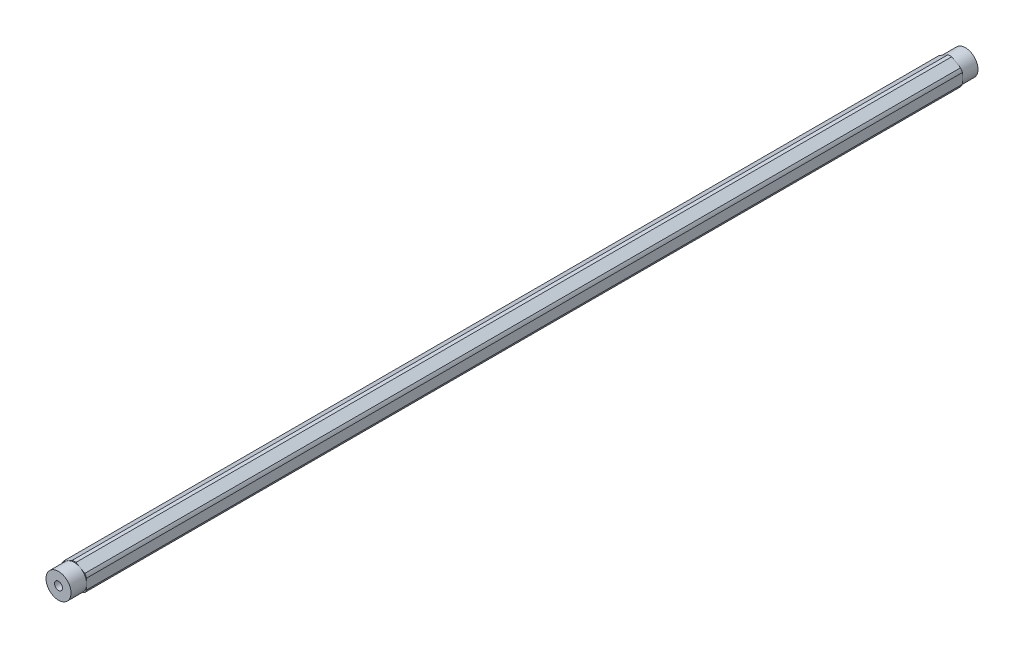
ISO-10303-21;
HEADER;
FILE_DESCRIPTION(('STEP AP214'),'2;1');
FILE_NAME('part.step','',(''),(''),'','','');
FILE_SCHEMA(('AUTOMOTIVE_DESIGN { 1 0 10303 214 1 1 1 1 }'));
ENDSEC;
DATA;
#1=APPLICATION_CONTEXT('core data for automotive mechanical design processes');
#2=APPLICATION_PROTOCOL_DEFINITION('international standard','automotive_design',2000,#1);
#3=PRODUCT_CONTEXT('',#1,'mechanical');
#4=PRODUCT('Part','Part','',(#3));
#5=PRODUCT_RELATED_PRODUCT_CATEGORY('part','',(#4));
#6=PRODUCT_DEFINITION_FORMATION('','',#4);
#7=PRODUCT_DEFINITION_CONTEXT('part definition',#1,'design');
#8=PRODUCT_DEFINITION('design','',#6,#7);
#9=PRODUCT_DEFINITION_SHAPE('','',#8);
#10=(LENGTH_UNIT() NAMED_UNIT(*) SI_UNIT(.MILLI.,.METRE.));
#11=(NAMED_UNIT(*) PLANE_ANGLE_UNIT() SI_UNIT($,.RADIAN.));
#12=(NAMED_UNIT(*) SI_UNIT($,.STERADIAN.) SOLID_ANGLE_UNIT());
#13=UNCERTAINTY_MEASURE_WITH_UNIT(LENGTH_MEASURE(1.E-05),#10,'distance_accuracy_value','');
#14=(GEOMETRIC_REPRESENTATION_CONTEXT(3) GLOBAL_UNCERTAINTY_ASSIGNED_CONTEXT((#13)) GLOBAL_UNIT_ASSIGNED_CONTEXT((#10,
#11,#12)) REPRESENTATION_CONTEXT('',''));
#15=CARTESIAN_POINT('',(0.,0.,0.));
#16=DIRECTION('',(0.,0.,1.));
#17=DIRECTION('',(1.,0.,0.));
#18=AXIS2_PLACEMENT_3D('',#15,#16,#17);
#19=CARTESIAN_POINT('',(0.,0.,-222.25));
#20=DIRECTION('',(0.,0.,1.));
#21=DIRECTION('',(1.,0.,0.));
#22=AXIS2_PLACEMENT_3D('',#19,#20,#21);
#23=PLANE('',#22);
#24=DIRECTION('',(0.,1.,0.));
#25=VECTOR('',#24,1.);
#26=CARTESIAN_POINT('',(6.35,0.,-222.25));
#27=LINE('',#26,#25);
#28=CARTESIAN_POINT('',(6.35,0.,-222.25));
#29=VERTEX_POINT('',#28);
#30=CARTESIAN_POINT('',(6.35,2.59030191290514,-222.25));
#31=VERTEX_POINT('',#30);
#32=EDGE_CURVE('E205',#29,#31,#27,.T.);
#33=ORIENTED_EDGE('',*,*,#32,.F.);
#34=CARTESIAN_POINT('',(0.,0.,-222.25));
#35=DIRECTION('',(0.,0.,1.));
#36=DIRECTION('',(1.,0.,0.));
#37=AXIS2_PLACEMENT_3D('',#34,#35,#36);
#38=CIRCLE('',#37,6.35);
#39=CARTESIAN_POINT('',(3.175,5.49926131403119,-222.25));
#40=VERTEX_POINT('',#39);
#41=EDGE_CURVE('E56',#29,#40,#38,.T.);
#42=ORIENTED_EDGE('',*,*,#41,.T.);
#43=DIRECTION('',(-0.866025403784439,0.5,0.));
#44=VECTOR('',#43,1.);
#45=CARTESIAN_POINT('',(3.175,5.49926131403119,-222.25));
#46=LINE('',#45,#44);
#47=CARTESIAN_POINT('',(5.41826726004727,4.20411035757862,-222.25));
#48=VERTEX_POINT('',#47);
#49=EDGE_CURVE('E247',#48,#40,#46,.T.);
#50=ORIENTED_EDGE('',*,*,#49,.F.);
#51=CARTESIAN_POINT('',(0.,0.,-222.25));
#52=DIRECTION('',(0.,0.,1.));
#53=DIRECTION('',(1.,0.,0.));
#54=AXIS2_PLACEMENT_3D('',#51,#52,#53);
#55=CIRCLE('',#54,6.858);
#56=EDGE_CURVE('E242',#31,#48,#55,.T.);
#57=ORIENTED_EDGE('',*,*,#56,.F.);
#58=EDGE_LOOP('',(#33,#42,#50,#57));
#59=FACE_BOUND('',#58,.T.);
#60=ADVANCED_FACE('F45',(#59),#23,.F.);
#61=CARTESIAN_POINT('',(0.931732739952726,6.79441227048375,-222.25));
#62=VERTEX_POINT('',#61);
#63=EDGE_CURVE('E244',#40,#62,#46,.T.);
#64=ORIENTED_EDGE('',*,*,#63,.F.);
#65=CARTESIAN_POINT('',(-3.175,5.49926131403119,-222.25));
#66=VERTEX_POINT('',#65);
#67=EDGE_CURVE('E11',#40,#66,#38,.T.);
#68=ORIENTED_EDGE('',*,*,#67,.T.);
#69=DIRECTION('',(-0.866025403784439,-0.5,0.));
#70=VECTOR('',#69,1.);
#71=CARTESIAN_POINT('',(-3.175,5.49926131403119,-222.25));
#72=LINE('',#71,#70);
#73=CARTESIAN_POINT('',(-0.931732739952723,6.79441227048375,-222.25));
#74=VERTEX_POINT('',#73);
#75=EDGE_CURVE('E250',#74,#66,#72,.T.);
#76=ORIENTED_EDGE('',*,*,#75,.F.);
#77=EDGE_CURVE('E246',#62,#74,#55,.T.);
#78=ORIENTED_EDGE('',*,*,#77,.F.);
#79=EDGE_LOOP('',(#64,#68,#76,#78));
#80=FACE_BOUND('',#79,.T.);
#81=ADVANCED_FACE('F376',(#80),#23,.F.);
#82=CARTESIAN_POINT('',(-5.41826726004727,4.20411035757862,-222.25));
#83=VERTEX_POINT('',#82);
#84=EDGE_CURVE('E254',#66,#83,#72,.T.);
#85=ORIENTED_EDGE('',*,*,#84,.F.);
#86=CARTESIAN_POINT('',(-6.35,0.,-222.25));
#87=VERTEX_POINT('',#86);
#88=EDGE_CURVE('E54',#66,#87,#38,.T.);
#89=ORIENTED_EDGE('',*,*,#88,.T.);
#90=DIRECTION('',(0.,-1.,0.));
#91=VECTOR('',#90,1.);
#92=CARTESIAN_POINT('',(-6.35,0.,-222.25));
#93=LINE('',#92,#91);
#94=CARTESIAN_POINT('',(-6.35,2.59030191290514,-222.25));
#95=VERTEX_POINT('',#94);
#96=EDGE_CURVE('E255',#95,#87,#93,.T.);
#97=ORIENTED_EDGE('',*,*,#96,.F.);
#98=EDGE_CURVE('E253',#83,#95,#55,.T.);
#99=ORIENTED_EDGE('',*,*,#98,.F.);
#100=EDGE_LOOP('',(#85,#89,#97,#99));
#101=FACE_BOUND('',#100,.T.);
#102=ADVANCED_FACE('F334',(#101),#23,.F.);
#103=CARTESIAN_POINT('',(-6.35,-2.59030191290515,-222.25));
#104=VERTEX_POINT('',#103);
#105=EDGE_CURVE('E259',#87,#104,#93,.T.);
#106=ORIENTED_EDGE('',*,*,#105,.F.);
#107=CARTESIAN_POINT('',(-3.175,-5.49926131403119,-222.25));
#108=VERTEX_POINT('',#107);
#109=EDGE_CURVE('E322',#87,#108,#38,.T.);
#110=ORIENTED_EDGE('',*,*,#109,.T.);
#111=DIRECTION('',(0.866025403784439,-0.5,0.));
#112=VECTOR('',#111,1.);
#113=CARTESIAN_POINT('',(-3.175,-5.49926131403118,-222.25));
#114=LINE('',#113,#112);
#115=CARTESIAN_POINT('',(-5.41826726004728,-4.20411035757861,-222.25));
#116=VERTEX_POINT('',#115);
#117=EDGE_CURVE('E260',#116,#108,#114,.T.);
#118=ORIENTED_EDGE('',*,*,#117,.F.);
#119=EDGE_CURVE('E258',#104,#116,#55,.T.);
#120=ORIENTED_EDGE('',*,*,#119,.F.);
#121=EDGE_LOOP('',(#106,#110,#118,#120));
#122=FACE_BOUND('',#121,.T.);
#123=ADVANCED_FACE('F337',(#122),#23,.F.);
#124=CARTESIAN_POINT('',(-0.931732739952717,-6.79441227048375,-222.25));
#125=VERTEX_POINT('',#124);
#126=EDGE_CURVE('E264',#108,#125,#114,.T.);
#127=ORIENTED_EDGE('',*,*,#126,.F.);
#128=CARTESIAN_POINT('',(3.175,-5.49926131403119,-222.25));
#129=VERTEX_POINT('',#128);
#130=EDGE_CURVE('E316',#108,#129,#38,.T.);
#131=ORIENTED_EDGE('',*,*,#130,.T.);
#132=DIRECTION('',(0.866025403784439,0.5,0.));
#133=VECTOR('',#132,1.);
#134=CARTESIAN_POINT('',(3.175,-5.49926131403118,-222.25));
#135=LINE('',#134,#133);
#136=CARTESIAN_POINT('',(0.931732739952725,-6.79441227048375,-222.25));
#137=VERTEX_POINT('',#136);
#138=EDGE_CURVE('E265',#137,#129,#135,.T.);
#139=ORIENTED_EDGE('',*,*,#138,.F.);
#140=EDGE_CURVE('E263',#125,#137,#55,.T.);
#141=ORIENTED_EDGE('',*,*,#140,.F.);
#142=EDGE_LOOP('',(#127,#131,#139,#141));
#143=FACE_BOUND('',#142,.T.);
#144=ADVANCED_FACE('F396',(#143),#23,.F.);
#145=CARTESIAN_POINT('',(0.,0.,222.25));
#146=DIRECTION('',(0.,0.,1.));
#147=DIRECTION('',(1.,0.,0.));
#148=AXIS2_PLACEMENT_3D('',#145,#146,#147);
#149=PLANE('',#148);
#150=CARTESIAN_POINT('',(0.,0.,222.25));
#151=DIRECTION('',(0.,0.,1.));
#152=DIRECTION('',(1.,0.,0.));
#153=AXIS2_PLACEMENT_3D('',#150,#151,#152);
#154=CIRCLE('',#153,6.35);
#155=CARTESIAN_POINT('',(6.35,0.,222.25));
#156=VERTEX_POINT('',#155);
#157=CARTESIAN_POINT('',(3.175,5.49926131403119,222.25));
#158=VERTEX_POINT('',#157);
#159=EDGE_CURVE('E201',#156,#158,#154,.T.);
#160=ORIENTED_EDGE('',*,*,#159,.F.);
#161=DIRECTION('',(0.,1.,0.));
#162=VECTOR('',#161,1.);
#163=CARTESIAN_POINT('',(6.35,0.,222.25));
#164=LINE('',#163,#162);
#165=CARTESIAN_POINT('',(6.35,2.59030191290514,222.25));
#166=VERTEX_POINT('',#165);
#167=EDGE_CURVE('E212',#156,#166,#164,.T.);
#168=ORIENTED_EDGE('',*,*,#167,.T.);
#169=CARTESIAN_POINT('',(0.,0.,222.25));
#170=DIRECTION('',(0.,0.,1.));
#171=DIRECTION('',(1.,0.,0.));
#172=AXIS2_PLACEMENT_3D('',#169,#170,#171);
#173=CIRCLE('',#172,6.858);
#174=CARTESIAN_POINT('',(5.41826726004727,4.20411035757862,222.25));
#175=VERTEX_POINT('',#174);
#176=EDGE_CURVE('E211',#166,#175,#173,.T.);
#177=ORIENTED_EDGE('',*,*,#176,.T.);
#178=DIRECTION('',(-0.866025403784439,0.5,0.));
#179=VECTOR('',#178,1.);
#180=CARTESIAN_POINT('',(3.175,5.49926131403119,222.25));
#181=LINE('',#180,#179);
#182=EDGE_CURVE('E217',#175,#158,#181,.T.);
#183=ORIENTED_EDGE('',*,*,#182,.T.);
#184=EDGE_LOOP('',(#160,#168,#177,#183));
#185=FACE_BOUND('',#184,.T.);
#186=ADVANCED_FACE('F359',(#185),#149,.T.);
#187=CARTESIAN_POINT('',(-3.175,5.49926131403119,222.25));
#188=VERTEX_POINT('',#187);
#189=EDGE_CURVE('E208',#158,#188,#154,.T.);
#190=ORIENTED_EDGE('',*,*,#189,.F.);
#191=CARTESIAN_POINT('',(0.931732739952726,6.79441227048375,222.25));
#192=VERTEX_POINT('',#191);
#193=EDGE_CURVE('E214',#158,#192,#181,.T.);
#194=ORIENTED_EDGE('',*,*,#193,.T.);
#195=CARTESIAN_POINT('',(-0.931732739952723,6.79441227048375,222.25));
#196=VERTEX_POINT('',#195);
#197=EDGE_CURVE('E216',#192,#196,#173,.T.);
#198=ORIENTED_EDGE('',*,*,#197,.T.);
#199=DIRECTION('',(-0.866025403784439,-0.5,0.));
#200=VECTOR('',#199,1.);
#201=CARTESIAN_POINT('',(-3.175,5.49926131403119,222.25));
#202=LINE('',#201,#200);
#203=EDGE_CURVE('E220',#196,#188,#202,.T.);
#204=ORIENTED_EDGE('',*,*,#203,.T.);
#205=EDGE_LOOP('',(#190,#194,#198,#204));
#206=FACE_BOUND('',#205,.T.);
#207=ADVANCED_FACE('F382',(#206),#149,.T.);
#208=CARTESIAN_POINT('',(-6.35,0.,222.25));
#209=VERTEX_POINT('',#208);
#210=EDGE_CURVE('E313',#188,#209,#154,.T.);
#211=ORIENTED_EDGE('',*,*,#210,.F.);
#212=CARTESIAN_POINT('',(-5.41826726004727,4.20411035757862,222.25));
#213=VERTEX_POINT('',#212);
#214=EDGE_CURVE('E224',#188,#213,#202,.T.);
#215=ORIENTED_EDGE('',*,*,#214,.T.);
#216=CARTESIAN_POINT('',(-6.35,2.59030191290514,222.25));
#217=VERTEX_POINT('',#216);
#218=EDGE_CURVE('E223',#213,#217,#173,.T.);
#219=ORIENTED_EDGE('',*,*,#218,.T.);
#220=DIRECTION('',(0.,-1.,0.));
#221=VECTOR('',#220,1.);
#222=CARTESIAN_POINT('',(-6.35,0.,222.25));
#223=LINE('',#222,#221);
#224=EDGE_CURVE('E225',#217,#209,#223,.T.);
#225=ORIENTED_EDGE('',*,*,#224,.T.);
#226=EDGE_LOOP('',(#211,#215,#219,#225));
#227=FACE_BOUND('',#226,.T.);
#228=ADVANCED_FACE('F403',(#227),#149,.T.);
#229=CARTESIAN_POINT('',(-3.175,-5.49926131403118,222.25));
#230=VERTEX_POINT('',#229);
#231=EDGE_CURVE('E311',#209,#230,#154,.T.);
#232=ORIENTED_EDGE('',*,*,#231,.F.);
#233=CARTESIAN_POINT('',(-6.35,-2.59030191290515,222.25));
#234=VERTEX_POINT('',#233);
#235=EDGE_CURVE('E229',#209,#234,#223,.T.);
#236=ORIENTED_EDGE('',*,*,#235,.T.);
#237=CARTESIAN_POINT('',(-5.41826726004728,-4.20411035757861,222.25));
#238=VERTEX_POINT('',#237);
#239=EDGE_CURVE('E228',#234,#238,#173,.T.);
#240=ORIENTED_EDGE('',*,*,#239,.T.);
#241=DIRECTION('',(0.866025403784439,-0.5,0.));
#242=VECTOR('',#241,1.);
#243=CARTESIAN_POINT('',(-3.175,-5.49926131403118,222.25));
#244=LINE('',#243,#242);
#245=EDGE_CURVE('E230',#238,#230,#244,.T.);
#246=ORIENTED_EDGE('',*,*,#245,.T.);
#247=EDGE_LOOP('',(#232,#236,#240,#246));
#248=FACE_BOUND('',#247,.T.);
#249=ADVANCED_FACE('F405',(#248),#149,.T.);
#250=CARTESIAN_POINT('',(3.175,-5.49926131403119,222.25));
#251=VERTEX_POINT('',#250);
#252=EDGE_CURVE('E308',#230,#251,#154,.T.);
#253=ORIENTED_EDGE('',*,*,#252,.F.);
#254=CARTESIAN_POINT('',(-0.931732739952717,-6.79441227048375,222.25));
#255=VERTEX_POINT('',#254);
#256=EDGE_CURVE('E234',#230,#255,#244,.T.);
#257=ORIENTED_EDGE('',*,*,#256,.T.);
#258=CARTESIAN_POINT('',(0.931732739952725,-6.79441227048375,222.25));
#259=VERTEX_POINT('',#258);
#260=EDGE_CURVE('E233',#255,#259,#173,.T.);
#261=ORIENTED_EDGE('',*,*,#260,.T.);
#262=DIRECTION('',(0.866025403784439,0.5,0.));
#263=VECTOR('',#262,1.);
#264=CARTESIAN_POINT('',(3.175,-5.49926131403118,222.25));
#265=LINE('',#264,#263);
#266=EDGE_CURVE('E235',#259,#251,#265,.T.);
#267=ORIENTED_EDGE('',*,*,#266,.T.);
#268=EDGE_LOOP('',(#253,#257,#261,#267));
#269=FACE_BOUND('',#268,.T.);
#270=ADVANCED_FACE('F411',(#269),#149,.T.);
#271=CARTESIAN_POINT('',(6.35,0.,222.25));
#272=DIRECTION('',(-1.,0.,0.));
#273=DIRECTION('',(0.,-1.,0.));
#274=AXIS2_PLACEMENT_3D('',#271,#272,#273);
#275=PLANE('',#274);
#276=CARTESIAN_POINT('',(6.35,-2.59030191290514,-222.25));
#277=VERTEX_POINT('',#276);
#278=EDGE_CURVE('E239',#277,#29,#27,.T.);
#279=ORIENTED_EDGE('',*,*,#278,.T.);
#280=ORIENTED_EDGE('',*,*,#32,.T.);
#281=DIRECTION('',(0.,0.,-1.));
#282=VECTOR('',#281,1.);
#283=CARTESIAN_POINT('',(6.35,2.59030191290514,222.25));
#284=LINE('',#283,#282);
#285=EDGE_CURVE('E49',#166,#31,#284,.T.);
#286=ORIENTED_EDGE('',*,*,#285,.F.);
#287=ORIENTED_EDGE('',*,*,#167,.F.);
#288=CARTESIAN_POINT('',(6.35,-2.59030191290514,222.25));
#289=VERTEX_POINT('',#288);
#290=EDGE_CURVE('E209',#289,#156,#164,.T.);
#291=ORIENTED_EDGE('',*,*,#290,.F.);
#292=DIRECTION('',(0.,0.,-1.));
#293=VECTOR('',#292,1.);
#294=CARTESIAN_POINT('',(6.35,-2.59030191290514,222.25));
#295=LINE('',#294,#293);
#296=EDGE_CURVE('E269',#289,#277,#295,.T.);
#297=ORIENTED_EDGE('',*,*,#296,.T.);
#298=EDGE_LOOP('',(#279,#280,#286,#287,#291,#297));
#299=FACE_BOUND('',#298,.T.);
#300=ADVANCED_FACE('F47',(#299),#275,.F.);
#301=CARTESIAN_POINT('',(0.,0.,222.25));
#302=DIRECTION('',(0.,0.,-1.));
#303=DIRECTION('',(-1.,0.,0.));
#304=AXIS2_PLACEMENT_3D('',#301,#302,#303);
#305=CYLINDRICAL_SURFACE('',#304,6.858);
#306=ORIENTED_EDGE('',*,*,#56,.T.);
#307=DIRECTION('',(0.,0.,-1.));
#308=VECTOR('',#307,1.);
#309=CARTESIAN_POINT('',(5.41826726004727,4.20411035757862,222.25));
#310=LINE('',#309,#308);
#311=EDGE_CURVE('E298',#175,#48,#310,.T.);
#312=ORIENTED_EDGE('',*,*,#311,.F.);
#313=ORIENTED_EDGE('',*,*,#176,.F.);
#314=ORIENTED_EDGE('',*,*,#285,.T.);
#315=EDGE_LOOP('',(#306,#312,#313,#314));
#316=FACE_BOUND('',#315,.T.);
#317=ADVANCED_FACE('F362',(#316),#305,.T.);
#318=CARTESIAN_POINT('',(3.175,5.49926131403119,222.25));
#319=DIRECTION('',(-0.5,-0.866025403784439,0.));
#320=DIRECTION('',(0.866025403784439,-0.5,0.));
#321=AXIS2_PLACEMENT_3D('',#318,#319,#320);
#322=PLANE('',#321);
#323=ORIENTED_EDGE('',*,*,#49,.T.);
#324=ORIENTED_EDGE('',*,*,#63,.T.);
#325=DIRECTION('',(0.,0.,-1.));
#326=VECTOR('',#325,1.);
#327=CARTESIAN_POINT('',(0.931732739952726,6.79441227048375,222.25));
#328=LINE('',#327,#326);
#329=EDGE_CURVE('E296',#192,#62,#328,.T.);
#330=ORIENTED_EDGE('',*,*,#329,.F.);
#331=ORIENTED_EDGE('',*,*,#193,.F.);
#332=ORIENTED_EDGE('',*,*,#182,.F.);
#333=ORIENTED_EDGE('',*,*,#311,.T.);
#334=EDGE_LOOP('',(#323,#324,#330,#331,#332,#333));
#335=FACE_BOUND('',#334,.T.);
#336=ADVANCED_FACE('F366',(#335),#322,.F.);
#337=ORIENTED_EDGE('',*,*,#77,.T.);
#338=DIRECTION('',(0.,0.,-1.));
#339=VECTOR('',#338,1.);
#340=CARTESIAN_POINT('',(-0.931732739952723,6.79441227048375,222.25));
#341=LINE('',#340,#339);
#342=EDGE_CURVE('E293',#196,#74,#341,.T.);
#343=ORIENTED_EDGE('',*,*,#342,.F.);
#344=ORIENTED_EDGE('',*,*,#197,.F.);
#345=ORIENTED_EDGE('',*,*,#329,.T.);
#346=EDGE_LOOP('',(#337,#343,#344,#345));
#347=FACE_BOUND('',#346,.T.);
#348=ADVANCED_FACE('F373',(#347),#305,.T.);
#349=CARTESIAN_POINT('',(-3.175,5.49926131403119,222.25));
#350=DIRECTION('',(0.5,-0.866025403784439,0.));
#351=DIRECTION('',(0.866025403784439,0.5,0.));
#352=AXIS2_PLACEMENT_3D('',#349,#350,#351);
#353=PLANE('',#352);
#354=ORIENTED_EDGE('',*,*,#75,.T.);
#355=ORIENTED_EDGE('',*,*,#84,.T.);
#356=DIRECTION('',(0.,0.,-1.));
#357=VECTOR('',#356,1.);
#358=CARTESIAN_POINT('',(-5.41826726004727,4.20411035757862,222.25));
#359=LINE('',#358,#357);
#360=EDGE_CURVE('E290',#213,#83,#359,.T.);
#361=ORIENTED_EDGE('',*,*,#360,.F.);
#362=ORIENTED_EDGE('',*,*,#214,.F.);
#363=ORIENTED_EDGE('',*,*,#203,.F.);
#364=ORIENTED_EDGE('',*,*,#342,.T.);
#365=EDGE_LOOP('',(#354,#355,#361,#362,#363,#364));
#366=FACE_BOUND('',#365,.T.);
#367=ADVANCED_FACE('F378',(#366),#353,.F.);
#368=ORIENTED_EDGE('',*,*,#98,.T.);
#369=DIRECTION('',(0.,0.,-1.));
#370=VECTOR('',#369,1.);
#371=CARTESIAN_POINT('',(-6.35,2.59030191290514,222.25));
#372=LINE('',#371,#370);
#373=EDGE_CURVE('E287',#217,#95,#372,.T.);
#374=ORIENTED_EDGE('',*,*,#373,.F.);
#375=ORIENTED_EDGE('',*,*,#218,.F.);
#376=ORIENTED_EDGE('',*,*,#360,.T.);
#377=EDGE_LOOP('',(#368,#374,#375,#376));
#378=FACE_BOUND('',#377,.T.);
#379=ADVANCED_FACE('F346',(#378),#305,.T.);
#380=CARTESIAN_POINT('',(-6.35,0.,222.25));
#381=DIRECTION('',(1.,0.,0.));
#382=DIRECTION('',(0.,1.,0.));
#383=AXIS2_PLACEMENT_3D('',#380,#381,#382);
#384=PLANE('',#383);
#385=ORIENTED_EDGE('',*,*,#96,.T.);
#386=ORIENTED_EDGE('',*,*,#105,.T.);
#387=DIRECTION('',(0.,0.,-1.));
#388=VECTOR('',#387,1.);
#389=CARTESIAN_POINT('',(-6.35,-2.59030191290515,222.25));
#390=LINE('',#389,#388);
#391=EDGE_CURVE('E284',#234,#104,#390,.T.);
#392=ORIENTED_EDGE('',*,*,#391,.F.);
#393=ORIENTED_EDGE('',*,*,#235,.F.);
#394=ORIENTED_EDGE('',*,*,#224,.F.);
#395=ORIENTED_EDGE('',*,*,#373,.T.);
#396=EDGE_LOOP('',(#385,#386,#392,#393,#394,#395));
#397=FACE_BOUND('',#396,.T.);
#398=ADVANCED_FACE('F340',(#397),#384,.F.);
#399=ORIENTED_EDGE('',*,*,#119,.T.);
#400=DIRECTION('',(0.,0.,-1.));
#401=VECTOR('',#400,1.);
#402=CARTESIAN_POINT('',(-5.41826726004728,-4.20411035757861,222.25));
#403=LINE('',#402,#401);
#404=EDGE_CURVE('E281',#238,#116,#403,.T.);
#405=ORIENTED_EDGE('',*,*,#404,.F.);
#406=ORIENTED_EDGE('',*,*,#239,.F.);
#407=ORIENTED_EDGE('',*,*,#391,.T.);
#408=EDGE_LOOP('',(#399,#405,#406,#407));
#409=FACE_BOUND('',#408,.T.);
#410=ADVANCED_FACE('F402',(#409),#305,.T.);
#411=CARTESIAN_POINT('',(-3.175,-5.49926131403118,222.25));
#412=DIRECTION('',(0.5,0.866025403784439,0.));
#413=DIRECTION('',(-0.866025403784439,0.5,0.));
#414=AXIS2_PLACEMENT_3D('',#411,#412,#413);
#415=PLANE('',#414);
#416=ORIENTED_EDGE('',*,*,#117,.T.);
#417=ORIENTED_EDGE('',*,*,#126,.T.);
#418=DIRECTION('',(0.,0.,-1.));
#419=VECTOR('',#418,1.);
#420=CARTESIAN_POINT('',(-0.931732739952717,-6.79441227048375,222.25));
#421=LINE('',#420,#419);
#422=EDGE_CURVE('E278',#255,#125,#421,.T.);
#423=ORIENTED_EDGE('',*,*,#422,.F.);
#424=ORIENTED_EDGE('',*,*,#256,.F.);
#425=ORIENTED_EDGE('',*,*,#245,.F.);
#426=ORIENTED_EDGE('',*,*,#404,.T.);
#427=EDGE_LOOP('',(#416,#417,#423,#424,#425,#426));
#428=FACE_BOUND('',#427,.T.);
#429=ADVANCED_FACE('F399',(#428),#415,.F.);
#430=ORIENTED_EDGE('',*,*,#140,.T.);
#431=DIRECTION('',(0.,0.,-1.));
#432=VECTOR('',#431,1.);
#433=CARTESIAN_POINT('',(0.931732739952725,-6.79441227048375,222.25));
#434=LINE('',#433,#432);
#435=EDGE_CURVE('E275',#259,#137,#434,.T.);
#436=ORIENTED_EDGE('',*,*,#435,.F.);
#437=ORIENTED_EDGE('',*,*,#260,.F.);
#438=ORIENTED_EDGE('',*,*,#422,.T.);
#439=EDGE_LOOP('',(#430,#436,#437,#438));
#440=FACE_BOUND('',#439,.T.);
#441=ADVANCED_FACE('F547',(#440),#305,.T.);
#442=CARTESIAN_POINT('',(3.175,-5.49926131403118,222.25));
#443=DIRECTION('',(-0.5,0.866025403784439,0.));
#444=DIRECTION('',(-0.866025403784439,-0.5,0.));
#445=AXIS2_PLACEMENT_3D('',#442,#443,#444);
#446=PLANE('',#445);
#447=ORIENTED_EDGE('',*,*,#138,.T.);
#448=CARTESIAN_POINT('',(5.41826726004727,-4.20411035757862,-222.25));
#449=VERTEX_POINT('',#448);
#450=EDGE_CURVE('E268',#129,#449,#135,.T.);
#451=ORIENTED_EDGE('',*,*,#450,.T.);
#452=DIRECTION('',(0.,0.,-1.));
#453=VECTOR('',#452,1.);
#454=CARTESIAN_POINT('',(5.41826726004727,-4.20411035757862,222.25));
#455=LINE('',#454,#453);
#456=CARTESIAN_POINT('',(5.41826726004727,-4.20411035757862,222.25));
#457=VERTEX_POINT('',#456);
#458=EDGE_CURVE('E272',#457,#449,#455,.T.);
#459=ORIENTED_EDGE('',*,*,#458,.F.);
#460=EDGE_CURVE('E238',#251,#457,#265,.T.);
#461=ORIENTED_EDGE('',*,*,#460,.F.);
#462=ORIENTED_EDGE('',*,*,#266,.F.);
#463=ORIENTED_EDGE('',*,*,#435,.T.);
#464=EDGE_LOOP('',(#447,#451,#459,#461,#462,#463));
#465=FACE_BOUND('',#464,.T.);
#466=ADVANCED_FACE('F394',(#465),#446,.F.);
#467=EDGE_CURVE('E245',#449,#277,#55,.T.);
#468=ORIENTED_EDGE('',*,*,#467,.T.);
#469=ORIENTED_EDGE('',*,*,#296,.F.);
#470=EDGE_CURVE('E215',#457,#289,#173,.T.);
#471=ORIENTED_EDGE('',*,*,#470,.F.);
#472=ORIENTED_EDGE('',*,*,#458,.T.);
#473=EDGE_LOOP('',(#468,#469,#471,#472));
#474=FACE_BOUND('',#473,.T.);
#475=ADVANCED_FACE('F391',(#474),#305,.T.);
#476=EDGE_CURVE('E70',#251,#156,#154,.T.);
#477=ORIENTED_EDGE('',*,*,#476,.F.);
#478=ORIENTED_EDGE('',*,*,#460,.T.);
#479=ORIENTED_EDGE('',*,*,#470,.T.);
#480=ORIENTED_EDGE('',*,*,#290,.T.);
#481=EDGE_LOOP('',(#477,#478,#479,#480));
#482=FACE_BOUND('',#481,.T.);
#483=ADVANCED_FACE('F389',(#482),#149,.T.);
#484=ORIENTED_EDGE('',*,*,#450,.F.);
#485=EDGE_CURVE('E189',#129,#29,#38,.T.);
#486=ORIENTED_EDGE('',*,*,#485,.T.);
#487=ORIENTED_EDGE('',*,*,#278,.F.);
#488=ORIENTED_EDGE('',*,*,#467,.F.);
#489=EDGE_LOOP('',(#484,#486,#487,#488));
#490=FACE_BOUND('',#489,.T.);
#491=ADVANCED_FACE('F392',(#490),#23,.F.);
#492=CARTESIAN_POINT('',(0.,0.,230.1875));
#493=DIRECTION('',(0.,0.,-1.));
#494=DIRECTION('',(-1.,0.,0.));
#495=AXIS2_PLACEMENT_3D('',#492,#493,#494);
#496=CYLINDRICAL_SURFACE('',#495,6.35);
#497=CARTESIAN_POINT('',(0.,0.,230.1875));
#498=DIRECTION('',(0.,0.,1.));
#499=DIRECTION('',(1.,0.,0.));
#500=AXIS2_PLACEMENT_3D('',#497,#498,#499);
#501=CIRCLE('',#500,6.35);
#502=CARTESIAN_POINT('',(6.35,0.,230.1875));
#503=VERTEX_POINT('',#502);
#504=EDGE_CURVE('E202',#503,#503,#501,.T.);
#505=ORIENTED_EDGE('',*,*,#504,.F.);
#506=EDGE_LOOP('',(#505));
#507=FACE_BOUND('',#506,.T.);
#508=ORIENTED_EDGE('',*,*,#159,.T.);
#509=ORIENTED_EDGE('',*,*,#189,.T.);
#510=ORIENTED_EDGE('',*,*,#210,.T.);
#511=ORIENTED_EDGE('',*,*,#231,.T.);
#512=ORIENTED_EDGE('',*,*,#252,.T.);
#513=ORIENTED_EDGE('',*,*,#476,.T.);
#514=EDGE_LOOP('',(#508,#509,#510,#511,#512,#513));
#515=FACE_BOUND('',#514,.T.);
#516=ADVANCED_FACE('F420',(#507,#515),#496,.T.);
#517=CARTESIAN_POINT('',(0.,0.,230.1875));
#518=DIRECTION('',(0.,0.,1.));
#519=DIRECTION('',(1.,0.,0.));
#520=AXIS2_PLACEMENT_3D('',#517,#518,#519);
#521=PLANE('',#520);
#522=CARTESIAN_POINT('',(0.,0.,230.1875));
#523=DIRECTION('',(0.,0.,1.));
#524=DIRECTION('',(1.,0.,0.));
#525=AXIS2_PLACEMENT_3D('',#522,#523,#524);
#526=CIRCLE('',#525,2.01929999999999);
#527=CARTESIAN_POINT('',(2.01929999999999,0.,230.1875));
#528=VERTEX_POINT('',#527);
#529=EDGE_CURVE('E194',#528,#528,#526,.T.);
#530=ORIENTED_EDGE('',*,*,#529,.F.);
#531=EDGE_LOOP('',(#530));
#532=FACE_BOUND('',#531,.T.);
#533=ORIENTED_EDGE('',*,*,#504,.T.);
#534=EDGE_LOOP('',(#533));
#535=FACE_BOUND('',#534,.T.);
#536=ADVANCED_FACE('F425',(#532,#535),#521,.T.);
#537=CARTESIAN_POINT('',(0.,0.,215.11006));
#538=DIRECTION('',(0.,0.,1.));
#539=DIRECTION('',(1.,0.,0.));
#540=AXIS2_PLACEMENT_3D('',#537,#538,#539);
#541=CONICAL_SURFACE('',#540,2.01929999999999,1.02974425867665);
#542=CARTESIAN_POINT('',(0.,0.,213.896742151998));
#543=VERTEX_POINT('',#542);
#544=VERTEX_LOOP('',#543);
#545=FACE_BOUND('',#544,.T.);
#546=CARTESIAN_POINT('',(0.,0.,215.11006));
#547=DIRECTION('',(0.,0.,1.));
#548=DIRECTION('',(1.,0.,0.));
#549=AXIS2_PLACEMENT_3D('',#546,#547,#548);
#550=CIRCLE('',#549,2.01929999999999);
#551=CARTESIAN_POINT('',(2.01929999999999,0.,215.11006));
#552=VERTEX_POINT('',#551);
#553=EDGE_CURVE('E198',#552,#552,#550,.T.);
#554=ORIENTED_EDGE('',*,*,#553,.T.);
#555=EDGE_LOOP('',(#554));
#556=FACE_BOUND('',#555,.T.);
#557=ADVANCED_FACE('F461',(#545,#556),#541,.F.);
#558=CARTESIAN_POINT('',(0.,0.,230.1875));
#559=DIRECTION('',(0.,0.,1.));
#560=DIRECTION('',(1.,0.,0.));
#561=AXIS2_PLACEMENT_3D('',#558,#559,#560);
#562=CYLINDRICAL_SURFACE('',#561,2.01929999999999);
#563=ORIENTED_EDGE('',*,*,#553,.F.);
#564=EDGE_LOOP('',(#563));
#565=FACE_BOUND('',#564,.T.);
#566=ORIENTED_EDGE('',*,*,#529,.T.);
#567=EDGE_LOOP('',(#566));
#568=FACE_BOUND('',#567,.T.);
#569=ADVANCED_FACE('F454',(#565,#568),#562,.F.);
#570=CARTESIAN_POINT('',(0.,0.,-230.1875));
#571=DIRECTION('',(0.,0.,1.));
#572=DIRECTION('',(1.,0.,0.));
#573=AXIS2_PLACEMENT_3D('',#570,#571,#572);
#574=CYLINDRICAL_SURFACE('',#573,6.35);
#575=CARTESIAN_POINT('',(0.,0.,-230.1875));
#576=DIRECTION('',(0.,0.,1.));
#577=DIRECTION('',(1.,0.,0.));
#578=AXIS2_PLACEMENT_3D('',#575,#576,#577);
#579=CIRCLE('',#578,6.35);
#580=CARTESIAN_POINT('',(6.35,0.,-230.1875));
#581=VERTEX_POINT('',#580);
#582=EDGE_CURVE('E188',#581,#581,#579,.T.);
#583=ORIENTED_EDGE('',*,*,#582,.T.);
#584=EDGE_LOOP('',(#583));
#585=FACE_BOUND('',#584,.T.);
#586=ORIENTED_EDGE('',*,*,#41,.F.);
#587=ORIENTED_EDGE('',*,*,#485,.F.);
#588=ORIENTED_EDGE('',*,*,#130,.F.);
#589=ORIENTED_EDGE('',*,*,#109,.F.);
#590=ORIENTED_EDGE('',*,*,#88,.F.);
#591=ORIENTED_EDGE('',*,*,#67,.F.);
#592=EDGE_LOOP('',(#586,#587,#588,#589,#590,#591));
#593=FACE_BOUND('',#592,.T.);
#594=ADVANCED_FACE('F460',(#585,#593),#574,.T.);
#595=CARTESIAN_POINT('',(0.,0.,-230.1875));
#596=DIRECTION('',(0.,0.,-1.));
#597=DIRECTION('',(1.,0.,0.));
#598=AXIS2_PLACEMENT_3D('',#595,#596,#597);
#599=PLANE('',#598);
#600=CARTESIAN_POINT('',(0.,0.,-230.1875));
#601=DIRECTION('',(0.,0.,-1.));
#602=DIRECTION('',(-1.,0.,0.));
#603=AXIS2_PLACEMENT_3D('',#600,#601,#602);
#604=CIRCLE('',#603,2.01929999999999);
#605=CARTESIAN_POINT('',(-2.01929999999999,0.,-230.1875));
#606=VERTEX_POINT('',#605);
#607=EDGE_CURVE('E186',#606,#606,#604,.T.);
#608=ORIENTED_EDGE('',*,*,#607,.F.);
#609=EDGE_LOOP('',(#608));
#610=FACE_BOUND('',#609,.T.);
#611=ORIENTED_EDGE('',*,*,#582,.F.);
#612=EDGE_LOOP('',(#611));
#613=FACE_BOUND('',#612,.T.);
#614=ADVANCED_FACE('F180',(#610,#613),#599,.T.);
#615=CARTESIAN_POINT('',(0.,0.,-215.11006));
#616=DIRECTION('',(0.,0.,-1.));
#617=DIRECTION('',(-1.,0.,0.));
#618=AXIS2_PLACEMENT_3D('',#615,#616,#617);
#619=CONICAL_SURFACE('',#618,2.01929999999999,1.02974425867665);
#620=CARTESIAN_POINT('',(0.,0.,-213.896742151998));
#621=VERTEX_POINT('',#620);
#622=VERTEX_LOOP('',#621);
#623=FACE_BOUND('',#622,.T.);
#624=CARTESIAN_POINT('',(0.,0.,-215.11006));
#625=DIRECTION('',(0.,0.,-1.));
#626=DIRECTION('',(-1.,0.,0.));
#627=AXIS2_PLACEMENT_3D('',#624,#625,#626);
#628=CIRCLE('',#627,2.01929999999999);
#629=CARTESIAN_POINT('',(-2.01929999999999,0.,-215.11006));
#630=VERTEX_POINT('',#629);
#631=EDGE_CURVE('E184',#630,#630,#628,.T.);
#632=ORIENTED_EDGE('',*,*,#631,.T.);
#633=EDGE_LOOP('',(#632));
#634=FACE_BOUND('',#633,.T.);
#635=ADVANCED_FACE('F176',(#623,#634),#619,.F.);
#636=CARTESIAN_POINT('',(0.,0.,-230.1875));
#637=DIRECTION('',(0.,0.,-1.));
#638=DIRECTION('',(-1.,0.,0.));
#639=AXIS2_PLACEMENT_3D('',#636,#637,#638);
#640=CYLINDRICAL_SURFACE('',#639,2.01929999999999);
#641=ORIENTED_EDGE('',*,*,#631,.F.);
#642=EDGE_LOOP('',(#641));
#643=FACE_BOUND('',#642,.T.);
#644=ORIENTED_EDGE('',*,*,#607,.T.);
#645=EDGE_LOOP('',(#644));
#646=FACE_BOUND('',#645,.T.);
#647=ADVANCED_FACE('F179',(#643,#646),#640,.F.);
#648=CLOSED_SHELL('',(#60,#81,#102,#123,#144,#186,#207,#228,#249,#270,#300,#317,#336,#348,#367,
#379,#398,#410,#429,#441,#466,#475,#483,#491,#516,#536,#557,#569,#594,#614,#635,#647));
#649=MANIFOLD_SOLID_BREP('B2',#648);
#650=ADVANCED_BREP_SHAPE_REPRESENTATION('',(#18,#649),#14);
#651=SHAPE_DEFINITION_REPRESENTATION(#9,#650);
ENDSEC;
END-ISO-10303-21;
